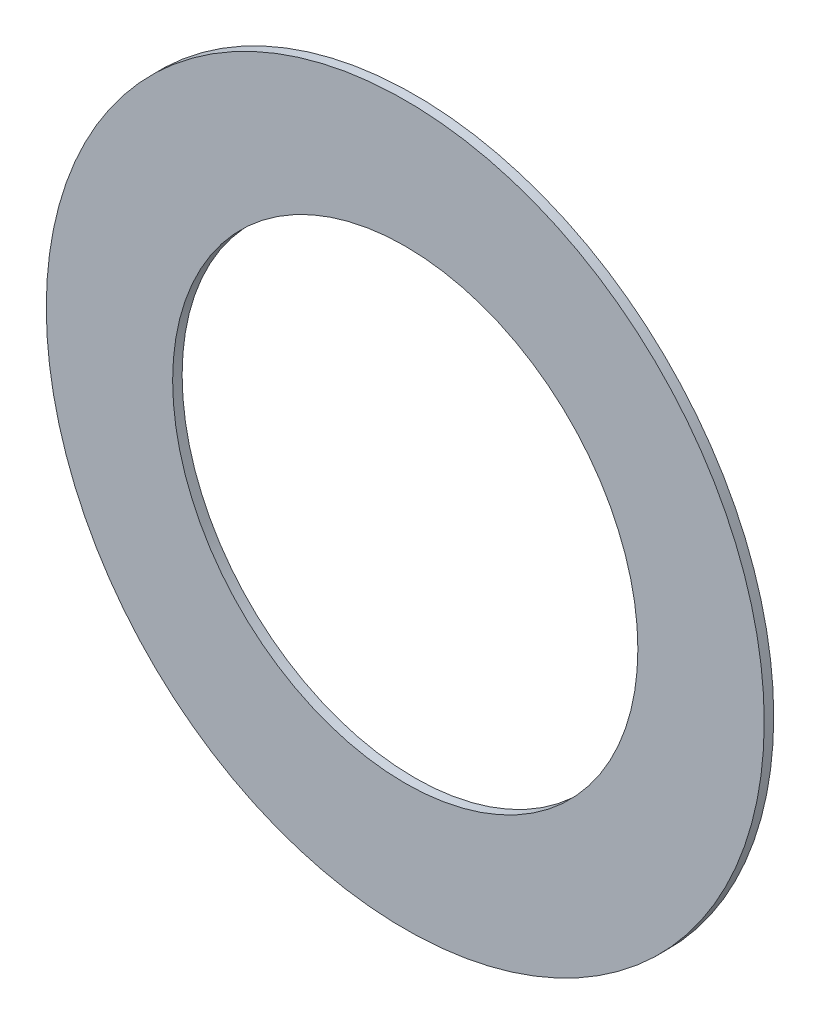
ISO-10303-21;
HEADER;
FILE_DESCRIPTION(('STEP AP214'),'2;1');
FILE_NAME('part.step','',(''),(''),'','','');
FILE_SCHEMA(('AUTOMOTIVE_DESIGN { 1 0 10303 214 1 1 1 1 }'));
ENDSEC;
DATA;
#1=APPLICATION_CONTEXT('core data for automotive mechanical design processes');
#2=APPLICATION_PROTOCOL_DEFINITION('international standard','automotive_design',2000,#1);
#3=PRODUCT_CONTEXT('',#1,'mechanical');
#4=PRODUCT('Part','Part','',(#3));
#5=PRODUCT_RELATED_PRODUCT_CATEGORY('part','',(#4));
#6=PRODUCT_DEFINITION_FORMATION('','',#4);
#7=PRODUCT_DEFINITION_CONTEXT('part definition',#1,'design');
#8=PRODUCT_DEFINITION('design','',#6,#7);
#9=PRODUCT_DEFINITION_SHAPE('','',#8);
#10=(LENGTH_UNIT() NAMED_UNIT(*) SI_UNIT(.MILLI.,.METRE.));
#11=(NAMED_UNIT(*) PLANE_ANGLE_UNIT() SI_UNIT($,.RADIAN.));
#12=(NAMED_UNIT(*) SI_UNIT($,.STERADIAN.) SOLID_ANGLE_UNIT());
#13=UNCERTAINTY_MEASURE_WITH_UNIT(LENGTH_MEASURE(1.E-05),#10,'distance_accuracy_value','');
#14=(GEOMETRIC_REPRESENTATION_CONTEXT(3) GLOBAL_UNCERTAINTY_ASSIGNED_CONTEXT((#13)) GLOBAL_UNIT_ASSIGNED_CONTEXT((#10,
#11,#12)) REPRESENTATION_CONTEXT('',''));
#15=CARTESIAN_POINT('',(0.,0.,0.));
#16=DIRECTION('',(0.,0.,1.));
#17=DIRECTION('',(1.,0.,0.));
#18=AXIS2_PLACEMENT_3D('',#15,#16,#17);
#19=CARTESIAN_POINT('',(0.,0.,0.21));
#20=DIRECTION('',(0.,0.,1.));
#21=DIRECTION('',(1.,0.,0.));
#22=AXIS2_PLACEMENT_3D('',#19,#20,#21);
#23=PLANE('',#22);
#24=CARTESIAN_POINT('',(0.,0.,0.21));
#25=DIRECTION('',(0.,0.,1.));
#26=DIRECTION('',(1.,0.,0.));
#27=AXIS2_PLACEMENT_3D('',#24,#25,#26);
#28=CIRCLE('',#27,7.9375);
#29=CARTESIAN_POINT('',(7.9375,0.,0.21));
#30=VERTEX_POINT('',#29);
#31=EDGE_CURVE('E10',#30,#30,#28,.T.);
#32=ORIENTED_EDGE('',*,*,#31,.T.);
#33=EDGE_LOOP('',(#32));
#34=FACE_BOUND('',#33,.T.);
#35=CARTESIAN_POINT('',(0.,0.,0.21));
#36=DIRECTION('',(0.,0.,1.));
#37=DIRECTION('',(1.,0.,0.));
#38=AXIS2_PLACEMENT_3D('',#35,#36,#37);
#39=CIRCLE('',#38,5.1435);
#40=CARTESIAN_POINT('',(5.1435,0.,0.21));
#41=VERTEX_POINT('',#40);
#42=EDGE_CURVE('E50',#41,#41,#39,.T.);
#43=ORIENTED_EDGE('',*,*,#42,.F.);
#44=EDGE_LOOP('',(#43));
#45=FACE_BOUND('',#44,.T.);
#46=ADVANCED_FACE('F37',(#34,#45),#23,.T.);
#47=CARTESIAN_POINT('',(0.,0.,0.));
#48=DIRECTION('',(0.,0.,1.));
#49=DIRECTION('',(1.,0.,0.));
#50=AXIS2_PLACEMENT_3D('',#47,#48,#49);
#51=PLANE('',#50);
#52=CARTESIAN_POINT('',(0.,0.,0.));
#53=DIRECTION('',(0.,0.,1.));
#54=DIRECTION('',(1.,0.,0.));
#55=AXIS2_PLACEMENT_3D('',#52,#53,#54);
#56=CIRCLE('',#55,7.9375);
#57=CARTESIAN_POINT('',(7.9375,0.,0.));
#58=VERTEX_POINT('',#57);
#59=EDGE_CURVE('E41',#58,#58,#56,.T.);
#60=ORIENTED_EDGE('',*,*,#59,.F.);
#61=EDGE_LOOP('',(#60));
#62=FACE_BOUND('',#61,.T.);
#63=CARTESIAN_POINT('',(0.,0.,0.));
#64=DIRECTION('',(0.,0.,1.));
#65=DIRECTION('',(1.,0.,0.));
#66=AXIS2_PLACEMENT_3D('',#63,#64,#65);
#67=CIRCLE('',#66,5.1435);
#68=CARTESIAN_POINT('',(5.1435,0.,0.));
#69=VERTEX_POINT('',#68);
#70=EDGE_CURVE('E52',#69,#69,#67,.T.);
#71=ORIENTED_EDGE('',*,*,#70,.T.);
#72=EDGE_LOOP('',(#71));
#73=FACE_BOUND('',#72,.T.);
#74=ADVANCED_FACE('F64',(#62,#73),#51,.F.);
#75=CARTESIAN_POINT('',(0.,0.,0.21));
#76=DIRECTION('',(0.,0.,-1.));
#77=DIRECTION('',(-1.,0.,0.));
#78=AXIS2_PLACEMENT_3D('',#75,#76,#77);
#79=CYLINDRICAL_SURFACE('',#78,7.9375);
#80=ORIENTED_EDGE('',*,*,#31,.F.);
#81=EDGE_LOOP('',(#80));
#82=FACE_BOUND('',#81,.T.);
#83=ORIENTED_EDGE('',*,*,#59,.T.);
#84=EDGE_LOOP('',(#83));
#85=FACE_BOUND('',#84,.T.);
#86=ADVANCED_FACE('F39',(#82,#85),#79,.T.);
#87=CARTESIAN_POINT('',(0.,0.,0.21));
#88=DIRECTION('',(0.,0.,-1.));
#89=DIRECTION('',(-1.,0.,0.));
#90=AXIS2_PLACEMENT_3D('',#87,#88,#89);
#91=CYLINDRICAL_SURFACE('',#90,5.1435);
#92=ORIENTED_EDGE('',*,*,#42,.T.);
#93=EDGE_LOOP('',(#92));
#94=FACE_BOUND('',#93,.T.);
#95=ORIENTED_EDGE('',*,*,#70,.F.);
#96=EDGE_LOOP('',(#95));
#97=FACE_BOUND('',#96,.T.);
#98=ADVANCED_FACE('F60',(#94,#97),#91,.F.);
#99=CLOSED_SHELL('',(#46,#74,#86,#98));
#100=MANIFOLD_SOLID_BREP('B2',#99);
#101=ADVANCED_BREP_SHAPE_REPRESENTATION('',(#18,#100),#14);
#102=SHAPE_DEFINITION_REPRESENTATION(#9,#101);
ENDSEC;
END-ISO-10303-21;
